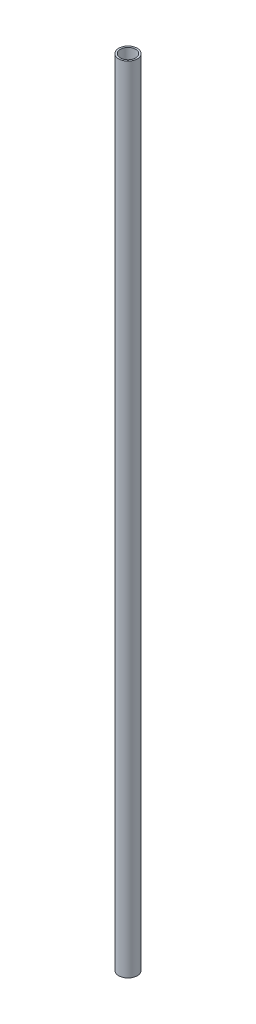
ISO-10303-21;
HEADER;
FILE_DESCRIPTION(('STEP AP214'),'2;1');
FILE_NAME('part.step','',(''),(''),'','','');
FILE_SCHEMA(('AUTOMOTIVE_DESIGN { 1 0 10303 214 1 1 1 1 }'));
ENDSEC;
DATA;
#1=APPLICATION_CONTEXT('core data for automotive mechanical design processes');
#2=APPLICATION_PROTOCOL_DEFINITION('international standard','automotive_design',2000,#1);
#3=PRODUCT_CONTEXT('',#1,'mechanical');
#4=PRODUCT('Part','Part','',(#3));
#5=PRODUCT_RELATED_PRODUCT_CATEGORY('part','',(#4));
#6=PRODUCT_DEFINITION_FORMATION('','',#4);
#7=PRODUCT_DEFINITION_CONTEXT('part definition',#1,'design');
#8=PRODUCT_DEFINITION('design','',#6,#7);
#9=PRODUCT_DEFINITION_SHAPE('','',#8);
#10=(LENGTH_UNIT() NAMED_UNIT(*) SI_UNIT(.MILLI.,.METRE.));
#11=(NAMED_UNIT(*) PLANE_ANGLE_UNIT() SI_UNIT($,.RADIAN.));
#12=(NAMED_UNIT(*) SI_UNIT($,.STERADIAN.) SOLID_ANGLE_UNIT());
#13=UNCERTAINTY_MEASURE_WITH_UNIT(LENGTH_MEASURE(1.E-05),#10,'distance_accuracy_value','');
#14=(GEOMETRIC_REPRESENTATION_CONTEXT(3) GLOBAL_UNCERTAINTY_ASSIGNED_CONTEXT((#13)) GLOBAL_UNIT_ASSIGNED_CONTEXT((#10,
#11,#12)) REPRESENTATION_CONTEXT('',''));
#15=CARTESIAN_POINT('',(0.,0.,0.));
#16=DIRECTION('',(0.,0.,1.));
#17=DIRECTION('',(1.,0.,0.));
#18=AXIS2_PLACEMENT_3D('',#15,#16,#17);
#19=CARTESIAN_POINT('',(0.,0.,0.));
#20=DIRECTION('',(0.,1.,0.));
#21=DIRECTION('',(0.,0.,1.));
#22=AXIS2_PLACEMENT_3D('',#19,#20,#21);
#23=CYLINDRICAL_SURFACE('',#22,17.272);
#24=CARTESIAN_POINT('',(0.,1803.4,0.));
#25=DIRECTION('',(0.,1.,0.));
#26=DIRECTION('',(0.,0.,1.));
#27=AXIS2_PLACEMENT_3D('',#24,#25,#26);
#28=CIRCLE('',#27,17.272);
#29=CARTESIAN_POINT('',(0.,1803.4,17.272));
#30=VERTEX_POINT('',#29);
#31=EDGE_CURVE('E17',#30,#30,#28,.F.);
#32=ORIENTED_EDGE('',*,*,#31,.F.);
#33=EDGE_LOOP('',(#32));
#34=FACE_BOUND('',#33,.T.);
#35=CARTESIAN_POINT('',(0.,0.,0.));
#36=DIRECTION('',(0.,1.,0.));
#37=DIRECTION('',(0.,0.,1.));
#38=AXIS2_PLACEMENT_3D('',#35,#36,#37);
#39=CIRCLE('',#38,17.272);
#40=CARTESIAN_POINT('',(0.,0.,17.272));
#41=VERTEX_POINT('',#40);
#42=EDGE_CURVE('E26',#41,#41,#39,.F.);
#43=ORIENTED_EDGE('',*,*,#42,.T.);
#44=EDGE_LOOP('',(#43));
#45=FACE_BOUND('',#44,.T.);
#46=ADVANCED_FACE('F14',(#34,#45),#23,.F.);
#47=CARTESIAN_POINT('',(0.,1803.4,0.));
#48=DIRECTION('',(0.,1.,0.));
#49=DIRECTION('',(0.,0.,1.));
#50=AXIS2_PLACEMENT_3D('',#47,#48,#49);
#51=PLANE('',#50);
#52=ORIENTED_EDGE('',*,*,#31,.T.);
#53=EDGE_LOOP('',(#52));
#54=FACE_BOUND('',#53,.T.);
#55=CARTESIAN_POINT('',(0.,1803.4,0.));
#56=DIRECTION('',(0.,1.,0.));
#57=DIRECTION('',(0.,0.,1.));
#58=AXIS2_PLACEMENT_3D('',#55,#56,#57);
#59=CIRCLE('',#58,21.082);
#60=CARTESIAN_POINT('',(0.,1803.4,21.082));
#61=VERTEX_POINT('',#60);
#62=EDGE_CURVE('E21',#61,#61,#59,.F.);
#63=ORIENTED_EDGE('',*,*,#62,.F.);
#64=EDGE_LOOP('',(#63));
#65=FACE_BOUND('',#64,.T.);
#66=ADVANCED_FACE('F34',(#54,#65),#51,.T.);
#67=CARTESIAN_POINT('',(0.,0.,0.));
#68=DIRECTION('',(0.,1.,0.));
#69=DIRECTION('',(0.,0.,1.));
#70=AXIS2_PLACEMENT_3D('',#67,#68,#69);
#71=PLANE('',#70);
#72=ORIENTED_EDGE('',*,*,#42,.F.);
#73=EDGE_LOOP('',(#72));
#74=FACE_BOUND('',#73,.T.);
#75=CARTESIAN_POINT('',(0.,0.,0.));
#76=DIRECTION('',(0.,1.,0.));
#77=DIRECTION('',(0.,0.,1.));
#78=AXIS2_PLACEMENT_3D('',#75,#76,#77);
#79=CIRCLE('',#78,21.082);
#80=CARTESIAN_POINT('',(0.,0.,21.082));
#81=VERTEX_POINT('',#80);
#82=EDGE_CURVE('E10',#81,#81,#79,.T.);
#83=ORIENTED_EDGE('',*,*,#82,.F.);
#84=EDGE_LOOP('',(#83));
#85=FACE_BOUND('',#84,.T.);
#86=ADVANCED_FACE('F42',(#74,#85),#71,.F.);
#87=CARTESIAN_POINT('',(0.,0.,0.));
#88=DIRECTION('',(0.,1.,0.));
#89=DIRECTION('',(0.,0.,1.));
#90=AXIS2_PLACEMENT_3D('',#87,#88,#89);
#91=CYLINDRICAL_SURFACE('',#90,21.082);
#92=ORIENTED_EDGE('',*,*,#62,.T.);
#93=EDGE_LOOP('',(#92));
#94=FACE_BOUND('',#93,.T.);
#95=ORIENTED_EDGE('',*,*,#82,.T.);
#96=EDGE_LOOP('',(#95));
#97=FACE_BOUND('',#96,.T.);
#98=ADVANCED_FACE('F43',(#94,#97),#91,.T.);
#99=CLOSED_SHELL('',(#46,#66,#86,#98));
#100=MANIFOLD_SOLID_BREP('B1',#99);
#101=ADVANCED_BREP_SHAPE_REPRESENTATION('',(#18,#100),#14);
#102=SHAPE_DEFINITION_REPRESENTATION(#9,#101);
ENDSEC;
END-ISO-10303-21;
